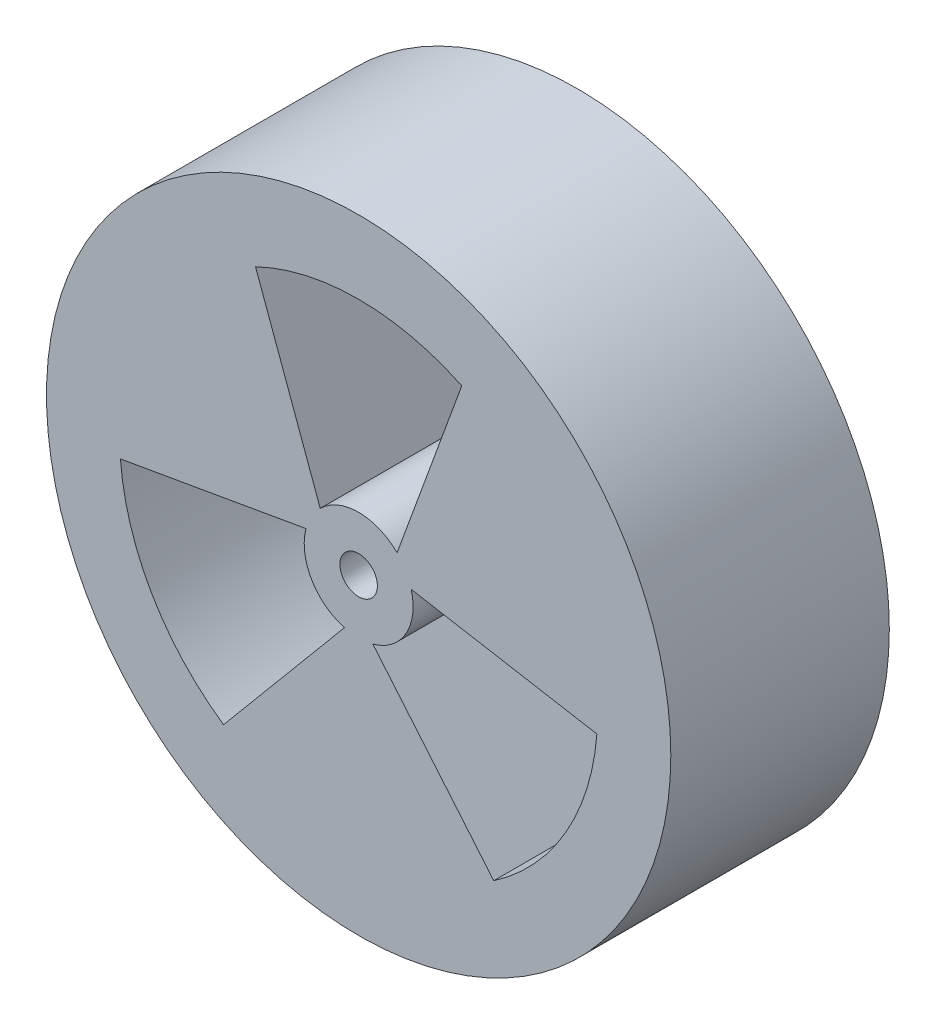
ISO-10303-21;
HEADER;
FILE_DESCRIPTION(('STEP AP214'),'2;1');
FILE_NAME('part.step','',(''),(''),'','','');
FILE_SCHEMA(('AUTOMOTIVE_DESIGN { 1 0 10303 214 1 1 1 1 }'));
ENDSEC;
DATA;
#1=APPLICATION_CONTEXT('core data for automotive mechanical design processes');
#2=APPLICATION_PROTOCOL_DEFINITION('international standard','automotive_design',2000,#1);
#3=PRODUCT_CONTEXT('',#1,'mechanical');
#4=PRODUCT('Part','Part','',(#3));
#5=PRODUCT_RELATED_PRODUCT_CATEGORY('part','',(#4));
#6=PRODUCT_DEFINITION_FORMATION('','',#4);
#7=PRODUCT_DEFINITION_CONTEXT('part definition',#1,'design');
#8=PRODUCT_DEFINITION('design','',#6,#7);
#9=PRODUCT_DEFINITION_SHAPE('','',#8);
#10=(LENGTH_UNIT() NAMED_UNIT(*) SI_UNIT(.MILLI.,.METRE.));
#11=(NAMED_UNIT(*) PLANE_ANGLE_UNIT() SI_UNIT($,.RADIAN.));
#12=(NAMED_UNIT(*) SI_UNIT($,.STERADIAN.) SOLID_ANGLE_UNIT());
#13=UNCERTAINTY_MEASURE_WITH_UNIT(LENGTH_MEASURE(1.E-05),#10,'distance_accuracy_value','');
#14=(GEOMETRIC_REPRESENTATION_CONTEXT(3) GLOBAL_UNCERTAINTY_ASSIGNED_CONTEXT((#13)) GLOBAL_UNIT_ASSIGNED_CONTEXT((#10,
#11,#12)) REPRESENTATION_CONTEXT('',''));
#15=CARTESIAN_POINT('',(0.,0.,0.));
#16=DIRECTION('',(0.,0.,1.));
#17=DIRECTION('',(1.,0.,0.));
#18=AXIS2_PLACEMENT_3D('',#15,#16,#17);
#19=CARTESIAN_POINT('',(0.,0.,35.));
#20=DIRECTION('',(0.,0.,1.));
#21=DIRECTION('',(1.,0.,0.));
#22=AXIS2_PLACEMENT_3D('',#19,#20,#21);
#23=PLANE('',#22);
#24=CARTESIAN_POINT('',(0.,0.,35.));
#25=DIRECTION('',(0.,0.,1.));
#26=DIRECTION('',(1.,0.,0.));
#27=AXIS2_PLACEMENT_3D('',#24,#25,#26);
#28=CIRCLE('',#27,50.);
#29=CARTESIAN_POINT('',(50.,0.,35.));
#30=VERTEX_POINT('',#29);
#31=EDGE_CURVE('E11',#30,#30,#28,.T.);
#32=ORIENTED_EDGE('',*,*,#31,.T.);
#33=EDGE_LOOP('',(#32));
#34=FACE_BOUND('',#33,.T.);
#35=CARTESIAN_POINT('',(0.,0.,35.));
#36=DIRECTION('',(0.,0.,1.));
#37=DIRECTION('',(1.,0.,0.));
#38=AXIS2_PLACEMENT_3D('',#35,#36,#37);
#39=CIRCLE('',#38,3.);
#40=CARTESIAN_POINT('',(3.,0.,35.));
#41=VERTEX_POINT('',#40);
#42=EDGE_CURVE('E121',#41,#41,#39,.T.);
#43=ORIENTED_EDGE('',*,*,#42,.F.);
#44=EDGE_LOOP('',(#43));
#45=FACE_BOUND('',#44,.T.);
#46=DIRECTION('',(-0.343414958043601,-0.939183776793398,0.));
#47=VECTOR('',#46,1.);
#48=CARTESIAN_POINT('',(6.15529830273519,6.18073022841704,35.));
#49=LINE('',#48,#47);
#50=CARTESIAN_POINT('',(16.5189630462717,34.5236592921516,35.));
#51=VERTEX_POINT('',#50);
#52=CARTESIAN_POINT('',(6.15529830273519,6.18073022841704,35.));
#53=VERTEX_POINT('',#52);
#54=EDGE_CURVE('E85',#51,#53,#49,.T.);
#55=ORIENTED_EDGE('',*,*,#54,.T.);
#56=CARTESIAN_POINT('',(0.,0.,35.));
#57=DIRECTION('',(0.,0.,-1.));
#58=DIRECTION('',(-1.,0.,0.));
#59=AXIS2_PLACEMENT_3D('',#56,#57,#58);
#60=CIRCLE('',#59,8.72290796421256);
#61=CARTESIAN_POINT('',(-6.15529830273519,6.18073022841704,35.));
#62=VERTEX_POINT('',#61);
#63=EDGE_CURVE('E87',#62,#53,#60,.T.);
#64=ORIENTED_EDGE('',*,*,#63,.F.);
#65=DIRECTION('',(0.343414958043601,-0.939183776793398,0.));
#66=VECTOR('',#65,1.);
#67=CARTESIAN_POINT('',(-6.15529830273519,6.18073022841704,35.));
#68=LINE('',#67,#66);
#69=CARTESIAN_POINT('',(-16.5189630462717,34.5236592921516,35.));
#70=VERTEX_POINT('',#69);
#71=EDGE_CURVE('E86',#70,#62,#68,.T.);
#72=ORIENTED_EDGE('',*,*,#71,.F.);
#73=CARTESIAN_POINT('',(0.,0.,35.));
#74=DIRECTION('',(0.,0.,1.));
#75=DIRECTION('',(-1.,0.,0.));
#76=AXIS2_PLACEMENT_3D('',#73,#74,#75);
#77=CIRCLE('',#76,38.2721725414779);
#78=EDGE_CURVE('E64',#51,#70,#77,.T.);
#79=ORIENTED_EDGE('',*,*,#78,.F.);
#80=EDGE_LOOP('',(#55,#64,#72,#79));
#81=FACE_BOUND('',#80,.T.);
#82=DIRECTION('',(-0.641649530503493,0.766997966102027,0.));
#83=VECTOR('',#82,1.);
#84=CARTESIAN_POINT('',(2.27502024037992,-8.42100981224845,35.));
#85=LINE('',#84,#83);
#86=CARTESIAN_POINT('',(21.638884455466,-31.5676712883235,35.));
#87=VERTEX_POINT('',#86);
#88=CARTESIAN_POINT('',(2.27502024037992,-8.42100981224845,35.));
#89=VERTEX_POINT('',#88);
#90=EDGE_CURVE('E203',#87,#89,#85,.T.);
#91=ORIENTED_EDGE('',*,*,#90,.T.);
#92=CARTESIAN_POINT('',(0.,0.,35.));
#93=DIRECTION('',(0.,0.,-1.));
#94=DIRECTION('',(0.500000000000004,0.866025403784436,0.));
#95=AXIS2_PLACEMENT_3D('',#92,#93,#94);
#96=CIRCLE('',#95,8.72290796421256);
#97=CARTESIAN_POINT('',(8.43031854311516,2.24027958383136,35.));
#98=VERTEX_POINT('',#97);
#99=EDGE_CURVE('E221',#98,#89,#96,.T.);
#100=ORIENTED_EDGE('',*,*,#99,.F.);
#101=DIRECTION('',(-0.985064488547097,0.172185810691379,0.));
#102=VECTOR('',#101,1.);
#103=CARTESIAN_POINT('',(8.43031854311516,2.24027958383136,35.));
#104=LINE('',#103,#102);
#105=CARTESIAN_POINT('',(38.1578475017378,-2.95598800382836,35.));
#106=VERTEX_POINT('',#105);
#107=EDGE_CURVE('E215',#106,#98,#104,.T.);
#108=ORIENTED_EDGE('',*,*,#107,.F.);
#109=CARTESIAN_POINT('',(0.,0.,35.));
#110=DIRECTION('',(0.,0.,1.));
#111=DIRECTION('',(0.500000000000004,0.866025403784436,0.));
#112=AXIS2_PLACEMENT_3D('',#109,#110,#111);
#113=CIRCLE('',#112,38.2721725414779);
#114=EDGE_CURVE('E224',#87,#106,#113,.T.);
#115=ORIENTED_EDGE('',*,*,#114,.F.);
#116=EDGE_LOOP('',(#91,#100,#108,#115));
#117=FACE_BOUND('',#116,.T.);
#118=DIRECTION('',(0.985064488547099,0.172185810691365,0.));
#119=VECTOR('',#118,1.);
#120=CARTESIAN_POINT('',(-8.43031854311513,2.24027958383147,35.));
#121=LINE('',#120,#119);
#122=CARTESIAN_POINT('',(-38.1578475017379,-2.95598800382782,35.));
#123=VERTEX_POINT('',#122);
#124=CARTESIAN_POINT('',(-8.43031854311513,2.24027958383147,35.));
#125=VERTEX_POINT('',#124);
#126=EDGE_CURVE('E189',#123,#125,#121,.T.);
#127=ORIENTED_EDGE('',*,*,#126,.T.);
#128=CARTESIAN_POINT('',(0.,0.,35.));
#129=DIRECTION('',(0.,0.,-1.));
#130=DIRECTION('',(0.499999999999992,-0.866025403784443,0.));
#131=AXIS2_PLACEMENT_3D('',#128,#129,#130);
#132=CIRCLE('',#131,8.72290796421256);
#133=CARTESIAN_POINT('',(-2.27502024038004,-8.42100981224842,35.));
#134=VERTEX_POINT('',#133);
#135=EDGE_CURVE('E194',#134,#125,#132,.T.);
#136=ORIENTED_EDGE('',*,*,#135,.F.);
#137=DIRECTION('',(0.641649530503504,0.766997966102018,0.));
#138=VECTOR('',#137,1.);
#139=CARTESIAN_POINT('',(-2.27502024038004,-8.42100981224842,35.));
#140=LINE('',#139,#138);
#141=CARTESIAN_POINT('',(-21.6388844554665,-31.5676712883232,35.));
#142=VERTEX_POINT('',#141);
#143=EDGE_CURVE('E177',#142,#134,#140,.T.);
#144=ORIENTED_EDGE('',*,*,#143,.F.);
#145=CARTESIAN_POINT('',(0.,0.,35.));
#146=DIRECTION('',(0.,0.,1.));
#147=DIRECTION('',(0.499999999999992,-0.866025403784443,0.));
#148=AXIS2_PLACEMENT_3D('',#145,#146,#147);
#149=CIRCLE('',#148,38.2721725414779);
#150=EDGE_CURVE('E236',#123,#142,#149,.T.);
#151=ORIENTED_EDGE('',*,*,#150,.F.);
#152=EDGE_LOOP('',(#127,#136,#144,#151));
#153=FACE_BOUND('',#152,.T.);
#154=ADVANCED_FACE('F35',(#34,#45,#81,#117,#153),#23,.T.);
#155=CARTESIAN_POINT('',(0.,0.,0.));
#156=DIRECTION('',(0.,0.,1.));
#157=DIRECTION('',(1.,0.,0.));
#158=AXIS2_PLACEMENT_3D('',#155,#156,#157);
#159=PLANE('',#158);
#160=CARTESIAN_POINT('',(0.,0.,0.));
#161=DIRECTION('',(0.,0.,-1.));
#162=DIRECTION('',(0.500000000000004,0.866025403784436,0.));
#163=AXIS2_PLACEMENT_3D('',#160,#161,#162);
#164=CIRCLE('',#163,8.72290796421256);
#165=CARTESIAN_POINT('',(8.43031854311516,2.24027958383136,0.));
#166=VERTEX_POINT('',#165);
#167=CARTESIAN_POINT('',(2.27502024037992,-8.42100981224845,0.));
#168=VERTEX_POINT('',#167);
#169=EDGE_CURVE('E211',#166,#168,#164,.T.);
#170=ORIENTED_EDGE('',*,*,#169,.T.);
#171=DIRECTION('',(-0.641649530503493,0.766997966102027,0.));
#172=VECTOR('',#171,1.);
#173=CARTESIAN_POINT('',(2.27502024037992,-8.42100981224845,0.));
#174=LINE('',#173,#172);
#175=CARTESIAN_POINT('',(21.638884455466,-31.5676712883235,0.));
#176=VERTEX_POINT('',#175);
#177=EDGE_CURVE('E199',#176,#168,#174,.T.);
#178=ORIENTED_EDGE('',*,*,#177,.F.);
#179=CARTESIAN_POINT('',(0.,0.,0.));
#180=DIRECTION('',(0.,0.,1.));
#181=DIRECTION('',(0.500000000000004,0.866025403784436,0.));
#182=AXIS2_PLACEMENT_3D('',#179,#180,#181);
#183=CIRCLE('',#182,38.2721725414779);
#184=CARTESIAN_POINT('',(38.1578475017378,-2.95598800382836,0.));
#185=VERTEX_POINT('',#184);
#186=EDGE_CURVE('E214',#176,#185,#183,.T.);
#187=ORIENTED_EDGE('',*,*,#186,.T.);
#188=DIRECTION('',(-0.985064488547097,0.172185810691379,0.));
#189=VECTOR('',#188,1.);
#190=CARTESIAN_POINT('',(8.43031854311516,2.24027958383136,0.));
#191=LINE('',#190,#189);
#192=EDGE_CURVE('E218',#185,#166,#191,.T.);
#193=ORIENTED_EDGE('',*,*,#192,.T.);
#194=EDGE_LOOP('',(#170,#178,#187,#193));
#195=FACE_BOUND('',#194,.T.);
#196=CARTESIAN_POINT('',(0.,0.,0.));
#197=DIRECTION('',(0.,0.,1.));
#198=DIRECTION('',(1.,0.,0.));
#199=AXIS2_PLACEMENT_3D('',#196,#197,#198);
#200=CIRCLE('',#199,3.);
#201=CARTESIAN_POINT('',(3.,0.,0.));
#202=VERTEX_POINT('',#201);
#203=EDGE_CURVE('E119',#202,#202,#200,.T.);
#204=ORIENTED_EDGE('',*,*,#203,.T.);
#205=EDGE_LOOP('',(#204));
#206=FACE_BOUND('',#205,.T.);
#207=CARTESIAN_POINT('',(0.,0.,0.));
#208=DIRECTION('',(0.,0.,1.));
#209=DIRECTION('',(1.,0.,0.));
#210=AXIS2_PLACEMENT_3D('',#207,#208,#209);
#211=CIRCLE('',#210,50.);
#212=CARTESIAN_POINT('',(50.,0.,0.));
#213=VERTEX_POINT('',#212);
#214=EDGE_CURVE('E39',#213,#213,#211,.T.);
#215=ORIENTED_EDGE('',*,*,#214,.F.);
#216=EDGE_LOOP('',(#215));
#217=FACE_BOUND('',#216,.T.);
#218=CARTESIAN_POINT('',(0.,0.,0.));
#219=DIRECTION('',(0.,0.,-1.));
#220=DIRECTION('',(-1.,0.,0.));
#221=AXIS2_PLACEMENT_3D('',#218,#219,#220);
#222=CIRCLE('',#221,8.72290796421256);
#223=CARTESIAN_POINT('',(-6.15529830273519,6.18073022841704,0.));
#224=VERTEX_POINT('',#223);
#225=CARTESIAN_POINT('',(6.15529830273519,6.18073022841704,0.));
#226=VERTEX_POINT('',#225);
#227=EDGE_CURVE('E109',#224,#226,#222,.T.);
#228=ORIENTED_EDGE('',*,*,#227,.T.);
#229=DIRECTION('',(-0.343414958043601,-0.939183776793398,0.));
#230=VECTOR('',#229,1.);
#231=CARTESIAN_POINT('',(6.15529830273519,6.18073022841704,0.));
#232=LINE('',#231,#230);
#233=CARTESIAN_POINT('',(16.5189630462717,34.5236592921516,0.));
#234=VERTEX_POINT('',#233);
#235=EDGE_CURVE('E99',#234,#226,#232,.T.);
#236=ORIENTED_EDGE('',*,*,#235,.F.);
#237=CARTESIAN_POINT('',(0.,0.,0.));
#238=DIRECTION('',(0.,0.,1.));
#239=DIRECTION('',(-1.,0.,0.));
#240=AXIS2_PLACEMENT_3D('',#237,#238,#239);
#241=CIRCLE('',#240,38.2721725414779);
#242=CARTESIAN_POINT('',(-16.5189630462717,34.5236592921516,0.));
#243=VERTEX_POINT('',#242);
#244=EDGE_CURVE('E69',#234,#243,#241,.T.);
#245=ORIENTED_EDGE('',*,*,#244,.T.);
#246=DIRECTION('',(0.343414958043601,-0.939183776793398,0.));
#247=VECTOR('',#246,1.);
#248=CARTESIAN_POINT('',(-6.15529830273519,6.18073022841704,0.));
#249=LINE('',#248,#247);
#250=EDGE_CURVE('E112',#243,#224,#249,.T.);
#251=ORIENTED_EDGE('',*,*,#250,.T.);
#252=EDGE_LOOP('',(#228,#236,#245,#251));
#253=FACE_BOUND('',#252,.T.);
#254=CARTESIAN_POINT('',(0.,0.,0.));
#255=DIRECTION('',(0.,0.,-1.));
#256=DIRECTION('',(0.499999999999992,-0.866025403784443,0.));
#257=AXIS2_PLACEMENT_3D('',#254,#255,#256);
#258=CIRCLE('',#257,8.72290796421256);
#259=CARTESIAN_POINT('',(-2.27502024038004,-8.42100981224842,0.));
#260=VERTEX_POINT('',#259);
#261=CARTESIAN_POINT('',(-8.43031854311513,2.24027958383147,0.));
#262=VERTEX_POINT('',#261);
#263=EDGE_CURVE('E163',#260,#262,#258,.T.);
#264=ORIENTED_EDGE('',*,*,#263,.T.);
#265=DIRECTION('',(0.985064488547099,0.172185810691365,0.));
#266=VECTOR('',#265,1.);
#267=CARTESIAN_POINT('',(-8.43031854311513,2.24027958383147,0.));
#268=LINE('',#267,#266);
#269=CARTESIAN_POINT('',(-38.1578475017379,-2.95598800382782,0.));
#270=VERTEX_POINT('',#269);
#271=EDGE_CURVE('E167',#270,#262,#268,.T.);
#272=ORIENTED_EDGE('',*,*,#271,.F.);
#273=CARTESIAN_POINT('',(0.,0.,0.));
#274=DIRECTION('',(0.,0.,1.));
#275=DIRECTION('',(0.499999999999992,-0.866025403784443,0.));
#276=AXIS2_PLACEMENT_3D('',#273,#274,#275);
#277=CIRCLE('',#276,38.2721725414779);
#278=CARTESIAN_POINT('',(-21.6388844554665,-31.5676712883232,0.));
#279=VERTEX_POINT('',#278);
#280=EDGE_CURVE('E176',#270,#279,#277,.T.);
#281=ORIENTED_EDGE('',*,*,#280,.T.);
#282=DIRECTION('',(0.641649530503504,0.766997966102018,0.));
#283=VECTOR('',#282,1.);
#284=CARTESIAN_POINT('',(-2.27502024038004,-8.42100981224842,0.));
#285=LINE('',#284,#283);
#286=EDGE_CURVE('E170',#279,#260,#285,.T.);
#287=ORIENTED_EDGE('',*,*,#286,.T.);
#288=EDGE_LOOP('',(#264,#272,#281,#287));
#289=FACE_BOUND('',#288,.T.);
#290=ADVANCED_FACE('F127',(#195,#206,#217,#253,#289),#159,.F.);
#291=CARTESIAN_POINT('',(0.,0.,35.));
#292=DIRECTION('',(0.,0.,-1.));
#293=DIRECTION('',(-1.,0.,0.));
#294=AXIS2_PLACEMENT_3D('',#291,#292,#293);
#295=CYLINDRICAL_SURFACE('',#294,50.);
#296=ORIENTED_EDGE('',*,*,#31,.F.);
#297=EDGE_LOOP('',(#296));
#298=FACE_BOUND('',#297,.T.);
#299=ORIENTED_EDGE('',*,*,#214,.T.);
#300=EDGE_LOOP('',(#299));
#301=FACE_BOUND('',#300,.T.);
#302=ADVANCED_FACE('F37',(#298,#301),#295,.T.);
#303=CARTESIAN_POINT('',(0.,0.,35.));
#304=DIRECTION('',(0.,0.,-1.));
#305=DIRECTION('',(-1.,0.,0.));
#306=AXIS2_PLACEMENT_3D('',#303,#304,#305);
#307=CYLINDRICAL_SURFACE('',#306,3.);
#308=ORIENTED_EDGE('',*,*,#42,.T.);
#309=EDGE_LOOP('',(#308));
#310=FACE_BOUND('',#309,.T.);
#311=ORIENTED_EDGE('',*,*,#203,.F.);
#312=EDGE_LOOP('',(#311));
#313=FACE_BOUND('',#312,.T.);
#314=ADVANCED_FACE('F130',(#310,#313),#307,.F.);
#315=CARTESIAN_POINT('',(0.,0.,0.));
#316=DIRECTION('',(0.,0.,1.));
#317=DIRECTION('',(1.,0.,0.));
#318=AXIS2_PLACEMENT_3D('',#315,#316,#317);
#319=CYLINDRICAL_SURFACE('',#318,8.72290796421256);
#320=DIRECTION('',(0.,0.,1.));
#321=VECTOR('',#320,1.);
#322=CARTESIAN_POINT('',(6.15529830273519,6.18073022841704,0.));
#323=LINE('',#322,#321);
#324=EDGE_CURVE('E94',#226,#53,#323,.T.);
#325=ORIENTED_EDGE('',*,*,#324,.F.);
#326=ORIENTED_EDGE('',*,*,#227,.F.);
#327=DIRECTION('',(0.,0.,1.));
#328=VECTOR('',#327,1.);
#329=CARTESIAN_POINT('',(-6.15529830273519,6.18073022841704,0.));
#330=LINE('',#329,#328);
#331=EDGE_CURVE('E52',#224,#62,#330,.T.);
#332=ORIENTED_EDGE('',*,*,#331,.T.);
#333=ORIENTED_EDGE('',*,*,#63,.T.);
#334=EDGE_LOOP('',(#325,#326,#332,#333));
#335=FACE_BOUND('',#334,.T.);
#336=ADVANCED_FACE('F132',(#335),#319,.T.);
#337=CARTESIAN_POINT('',(-6.15529830273519,6.18073022841704,0.));
#338=DIRECTION('',(-0.939183776793398,-0.343414958043601,0.));
#339=DIRECTION('',(0.343414958043601,-0.939183776793398,0.));
#340=AXIS2_PLACEMENT_3D('',#337,#338,#339);
#341=PLANE('',#340);
#342=ORIENTED_EDGE('',*,*,#71,.T.);
#343=ORIENTED_EDGE('',*,*,#331,.F.);
#344=ORIENTED_EDGE('',*,*,#250,.F.);
#345=DIRECTION('',(0.,0.,1.));
#346=VECTOR('',#345,1.);
#347=CARTESIAN_POINT('',(-16.5189630462717,34.5236592921516,0.));
#348=LINE('',#347,#346);
#349=EDGE_CURVE('E115',#243,#70,#348,.T.);
#350=ORIENTED_EDGE('',*,*,#349,.T.);
#351=EDGE_LOOP('',(#342,#343,#344,#350));
#352=FACE_BOUND('',#351,.T.);
#353=ADVANCED_FACE('F139',(#352),#341,.F.);
#354=CARTESIAN_POINT('',(0.,0.,0.));
#355=DIRECTION('',(0.,0.,1.));
#356=DIRECTION('',(1.,0.,0.));
#357=AXIS2_PLACEMENT_3D('',#354,#355,#356);
#358=CYLINDRICAL_SURFACE('',#357,38.2721725414779);
#359=ORIENTED_EDGE('',*,*,#78,.T.);
#360=ORIENTED_EDGE('',*,*,#349,.F.);
#361=ORIENTED_EDGE('',*,*,#244,.F.);
#362=DIRECTION('',(0.,0.,1.));
#363=VECTOR('',#362,1.);
#364=CARTESIAN_POINT('',(16.5189630462717,34.5236592921516,0.));
#365=LINE('',#364,#363);
#366=EDGE_CURVE('E89',#234,#51,#365,.T.);
#367=ORIENTED_EDGE('',*,*,#366,.T.);
#368=EDGE_LOOP('',(#359,#360,#361,#367));
#369=FACE_BOUND('',#368,.T.);
#370=ADVANCED_FACE('F90',(#369),#358,.F.);
#371=CARTESIAN_POINT('',(6.15529830273519,6.18073022841704,0.));
#372=DIRECTION('',(-0.939183776793398,0.343414958043601,0.));
#373=DIRECTION('',(-0.343414958043601,-0.939183776793398,0.));
#374=AXIS2_PLACEMENT_3D('',#371,#372,#373);
#375=PLANE('',#374);
#376=ORIENTED_EDGE('',*,*,#54,.F.);
#377=ORIENTED_EDGE('',*,*,#366,.F.);
#378=ORIENTED_EDGE('',*,*,#235,.T.);
#379=ORIENTED_EDGE('',*,*,#324,.T.);
#380=EDGE_LOOP('',(#376,#377,#378,#379));
#381=FACE_BOUND('',#380,.T.);
#382=ADVANCED_FACE('F97',(#381),#375,.T.);
#383=CARTESIAN_POINT('',(0.,0.,0.));
#384=DIRECTION('',(0.,0.,1.));
#385=DIRECTION('',(1.,0.,0.));
#386=AXIS2_PLACEMENT_3D('',#383,#384,#385);
#387=CYLINDRICAL_SURFACE('',#386,8.72290796421256);
#388=ORIENTED_EDGE('',*,*,#135,.T.);
#389=DIRECTION('',(0.,0.,1.));
#390=VECTOR('',#389,1.);
#391=CARTESIAN_POINT('',(-8.43031854311513,2.24027958383147,0.));
#392=LINE('',#391,#390);
#393=EDGE_CURVE('E185',#262,#125,#392,.T.);
#394=ORIENTED_EDGE('',*,*,#393,.F.);
#395=ORIENTED_EDGE('',*,*,#263,.F.);
#396=DIRECTION('',(0.,0.,1.));
#397=VECTOR('',#396,1.);
#398=CARTESIAN_POINT('',(-2.27502024038004,-8.42100981224842,0.));
#399=LINE('',#398,#397);
#400=EDGE_CURVE('E225',#260,#134,#399,.T.);
#401=ORIENTED_EDGE('',*,*,#400,.T.);
#402=EDGE_LOOP('',(#388,#394,#395,#401));
#403=FACE_BOUND('',#402,.T.);
#404=ADVANCED_FACE('F192',(#403),#387,.T.);
#405=CARTESIAN_POINT('',(-2.27502024038004,-8.42100981224842,0.));
#406=DIRECTION('',(0.766997966102019,-0.641649530503504,0.));
#407=DIRECTION('',(0.641649530503504,0.766997966102019,0.));
#408=AXIS2_PLACEMENT_3D('',#405,#406,#407);
#409=PLANE('',#408);
#410=ORIENTED_EDGE('',*,*,#143,.T.);
#411=ORIENTED_EDGE('',*,*,#400,.F.);
#412=ORIENTED_EDGE('',*,*,#286,.F.);
#413=DIRECTION('',(0.,0.,1.));
#414=VECTOR('',#413,1.);
#415=CARTESIAN_POINT('',(-21.6388844554665,-31.5676712883232,0.));
#416=LINE('',#415,#414);
#417=EDGE_CURVE('E234',#279,#142,#416,.T.);
#418=ORIENTED_EDGE('',*,*,#417,.T.);
#419=EDGE_LOOP('',(#410,#411,#412,#418));
#420=FACE_BOUND('',#419,.T.);
#421=ADVANCED_FACE('F245',(#420),#409,.F.);
#422=CARTESIAN_POINT('',(0.,0.,0.));
#423=DIRECTION('',(0.,0.,1.));
#424=DIRECTION('',(1.,0.,0.));
#425=AXIS2_PLACEMENT_3D('',#422,#423,#424);
#426=CYLINDRICAL_SURFACE('',#425,38.2721725414779);
#427=ORIENTED_EDGE('',*,*,#150,.T.);
#428=ORIENTED_EDGE('',*,*,#417,.F.);
#429=ORIENTED_EDGE('',*,*,#280,.F.);
#430=DIRECTION('',(0.,0.,1.));
#431=VECTOR('',#430,1.);
#432=CARTESIAN_POINT('',(-38.1578475017379,-2.95598800382782,0.));
#433=LINE('',#432,#431);
#434=EDGE_CURVE('E188',#270,#123,#433,.T.);
#435=ORIENTED_EDGE('',*,*,#434,.T.);
#436=EDGE_LOOP('',(#427,#428,#429,#435));
#437=FACE_BOUND('',#436,.T.);
#438=ADVANCED_FACE('F254',(#437),#426,.F.);
#439=CARTESIAN_POINT('',(0.,0.,0.));
#440=DIRECTION('',(0.,0.,1.));
#441=DIRECTION('',(1.,0.,0.));
#442=AXIS2_PLACEMENT_3D('',#439,#440,#441);
#443=CYLINDRICAL_SURFACE('',#442,8.72290796421256);
#444=ORIENTED_EDGE('',*,*,#99,.T.);
#445=DIRECTION('',(0.,0.,1.));
#446=VECTOR('',#445,1.);
#447=CARTESIAN_POINT('',(2.27502024037992,-8.42100981224845,0.));
#448=LINE('',#447,#446);
#449=EDGE_CURVE('E202',#168,#89,#448,.T.);
#450=ORIENTED_EDGE('',*,*,#449,.F.);
#451=ORIENTED_EDGE('',*,*,#169,.F.);
#452=DIRECTION('',(0.,0.,1.));
#453=VECTOR('',#452,1.);
#454=CARTESIAN_POINT('',(8.43031854311516,2.24027958383136,0.));
#455=LINE('',#454,#453);
#456=EDGE_CURVE('E100',#166,#98,#455,.T.);
#457=ORIENTED_EDGE('',*,*,#456,.T.);
#458=EDGE_LOOP('',(#444,#450,#451,#457));
#459=FACE_BOUND('',#458,.T.);
#460=ADVANCED_FACE('F289',(#459),#443,.T.);
#461=CARTESIAN_POINT('',(8.43031854311516,2.24027958383136,0.));
#462=DIRECTION('',(0.172185810691379,0.985064488547096,0.));
#463=DIRECTION('',(-0.985064488547096,0.172185810691379,0.));
#464=AXIS2_PLACEMENT_3D('',#461,#462,#463);
#465=PLANE('',#464);
#466=ORIENTED_EDGE('',*,*,#107,.T.);
#467=ORIENTED_EDGE('',*,*,#456,.F.);
#468=ORIENTED_EDGE('',*,*,#192,.F.);
#469=DIRECTION('',(0.,0.,1.));
#470=VECTOR('',#469,1.);
#471=CARTESIAN_POINT('',(38.1578475017378,-2.95598800382836,0.));
#472=LINE('',#471,#470);
#473=EDGE_CURVE('E104',#185,#106,#472,.T.);
#474=ORIENTED_EDGE('',*,*,#473,.T.);
#475=EDGE_LOOP('',(#466,#467,#468,#474));
#476=FACE_BOUND('',#475,.T.);
#477=ADVANCED_FACE('F295',(#476),#465,.F.);
#478=CARTESIAN_POINT('',(0.,0.,0.));
#479=DIRECTION('',(0.,0.,1.));
#480=DIRECTION('',(1.,0.,0.));
#481=AXIS2_PLACEMENT_3D('',#478,#479,#480);
#482=CYLINDRICAL_SURFACE('',#481,38.2721725414779);
#483=ORIENTED_EDGE('',*,*,#114,.T.);
#484=ORIENTED_EDGE('',*,*,#473,.F.);
#485=ORIENTED_EDGE('',*,*,#186,.F.);
#486=DIRECTION('',(0.,0.,1.));
#487=VECTOR('',#486,1.);
#488=CARTESIAN_POINT('',(21.638884455466,-31.5676712883235,0.));
#489=LINE('',#488,#487);
#490=EDGE_CURVE('E206',#176,#87,#489,.T.);
#491=ORIENTED_EDGE('',*,*,#490,.T.);
#492=EDGE_LOOP('',(#483,#484,#485,#491));
#493=FACE_BOUND('',#492,.T.);
#494=ADVANCED_FACE('F293',(#493),#482,.F.);
#495=CARTESIAN_POINT('',(2.27502024037992,-8.42100981224845,0.));
#496=DIRECTION('',(0.766997966102028,0.641649530503493,0.));
#497=DIRECTION('',(-0.641649530503493,0.766997966102028,0.));
#498=AXIS2_PLACEMENT_3D('',#495,#496,#497);
#499=PLANE('',#498);
#500=ORIENTED_EDGE('',*,*,#90,.F.);
#501=ORIENTED_EDGE('',*,*,#490,.F.);
#502=ORIENTED_EDGE('',*,*,#177,.T.);
#503=ORIENTED_EDGE('',*,*,#449,.T.);
#504=EDGE_LOOP('',(#500,#501,#502,#503));
#505=FACE_BOUND('',#504,.T.);
#506=ADVANCED_FACE('F288',(#505),#499,.T.);
#507=CARTESIAN_POINT('',(-8.43031854311513,2.24027958383147,0.));
#508=DIRECTION('',(0.172185810691365,-0.985064488547099,0.));
#509=DIRECTION('',(0.985064488547099,0.172185810691365,0.));
#510=AXIS2_PLACEMENT_3D('',#507,#508,#509);
#511=PLANE('',#510);
#512=ORIENTED_EDGE('',*,*,#126,.F.);
#513=ORIENTED_EDGE('',*,*,#434,.F.);
#514=ORIENTED_EDGE('',*,*,#271,.T.);
#515=ORIENTED_EDGE('',*,*,#393,.T.);
#516=EDGE_LOOP('',(#512,#513,#514,#515));
#517=FACE_BOUND('',#516,.T.);
#518=ADVANCED_FACE('F183',(#517),#511,.T.);
#519=CLOSED_SHELL('',(#154,#290,#302,#314,#336,#353,#370,#382,#404,#421,#438,#460,#477,#494,
#506,#518));
#520=MANIFOLD_SOLID_BREP('B2',#519);
#521=ADVANCED_BREP_SHAPE_REPRESENTATION('',(#18,#520),#14);
#522=SHAPE_DEFINITION_REPRESENTATION(#9,#521);
ENDSEC;
END-ISO-10303-21;
